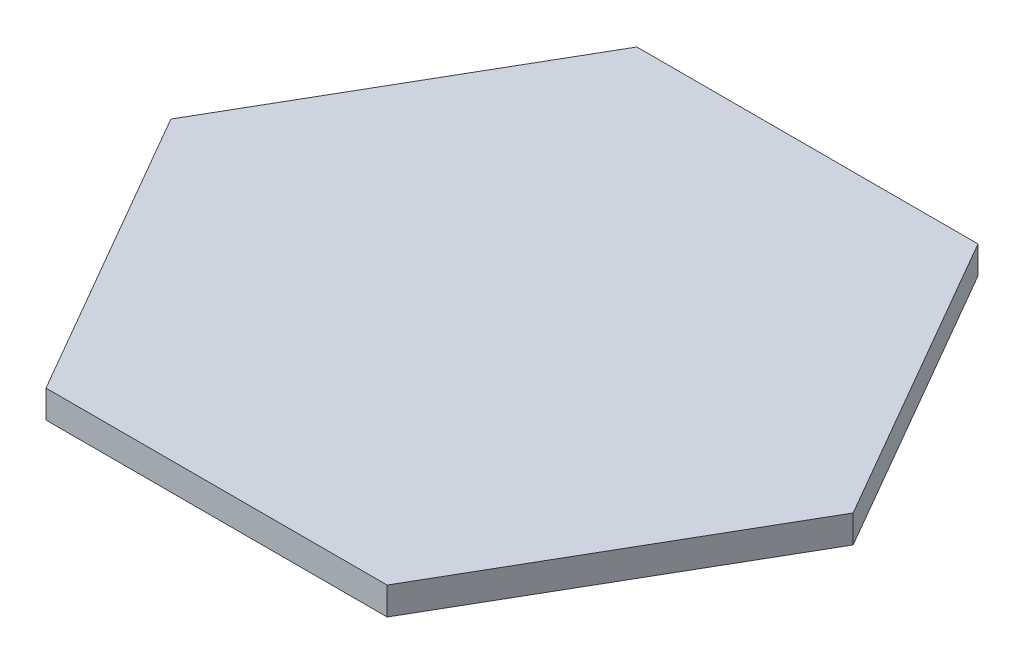
ISO-10303-21;
HEADER;
FILE_DESCRIPTION(('STEP AP214'),'2;1');
FILE_NAME('part.step','',(''),(''),'','','');
FILE_SCHEMA(('AUTOMOTIVE_DESIGN { 1 0 10303 214 1 1 1 1 }'));
ENDSEC;
DATA;
#1=APPLICATION_CONTEXT('core data for automotive mechanical design processes');
#2=APPLICATION_PROTOCOL_DEFINITION('international standard','automotive_design',2000,#1);
#3=PRODUCT_CONTEXT('',#1,'mechanical');
#4=PRODUCT('Part','Part','',(#3));
#5=PRODUCT_RELATED_PRODUCT_CATEGORY('part','',(#4));
#6=PRODUCT_DEFINITION_FORMATION('','',#4);
#7=PRODUCT_DEFINITION_CONTEXT('part definition',#1,'design');
#8=PRODUCT_DEFINITION('design','',#6,#7);
#9=PRODUCT_DEFINITION_SHAPE('','',#8);
#10=(LENGTH_UNIT() NAMED_UNIT(*) SI_UNIT(.MILLI.,.METRE.));
#11=(NAMED_UNIT(*) PLANE_ANGLE_UNIT() SI_UNIT($,.RADIAN.));
#12=(NAMED_UNIT(*) SI_UNIT($,.STERADIAN.) SOLID_ANGLE_UNIT());
#13=UNCERTAINTY_MEASURE_WITH_UNIT(LENGTH_MEASURE(1.E-05),#10,'distance_accuracy_value','');
#14=(GEOMETRIC_REPRESENTATION_CONTEXT(3) GLOBAL_UNCERTAINTY_ASSIGNED_CONTEXT((#13)) GLOBAL_UNIT_ASSIGNED_CONTEXT((#10,
#11,#12)) REPRESENTATION_CONTEXT('',''));
#15=CARTESIAN_POINT('',(0.,0.,0.));
#16=DIRECTION('',(0.,0.,1.));
#17=DIRECTION('',(1.,0.,0.));
#18=AXIS2_PLACEMENT_3D('',#15,#16,#17);
#19=CARTESIAN_POINT('',(-117.317574699332,19.05,-203.2));
#20=DIRECTION('',(0.866025403784439,0.,0.5));
#21=DIRECTION('',(0.5,0.,-0.866025403784438));
#22=AXIS2_PLACEMENT_3D('',#19,#20,#21);
#23=PLANE('',#22);
#24=DIRECTION('',(-0.5,0.,0.866025403784439));
#25=VECTOR('',#24,1.);
#26=CARTESIAN_POINT('',(-117.317574699332,0.,-203.2));
#27=LINE('',#26,#25);
#28=CARTESIAN_POINT('',(-117.317574699332,0.,-203.2));
#29=VERTEX_POINT('',#28);
#30=CARTESIAN_POINT('',(-234.635149398664,0.,0.));
#31=VERTEX_POINT('',#30);
#32=EDGE_CURVE('E117',#29,#31,#27,.T.);
#33=ORIENTED_EDGE('',*,*,#32,.T.);
#34=DIRECTION('',(0.,-1.,0.));
#35=VECTOR('',#34,1.);
#36=CARTESIAN_POINT('',(-234.635149398664,19.05,0.));
#37=LINE('',#36,#35);
#38=CARTESIAN_POINT('',(-234.635149398664,19.05,0.));
#39=VERTEX_POINT('',#38);
#40=EDGE_CURVE('E11',#39,#31,#37,.T.);
#41=ORIENTED_EDGE('',*,*,#40,.F.);
#42=DIRECTION('',(-0.5,0.,0.866025403784439));
#43=VECTOR('',#42,1.);
#44=CARTESIAN_POINT('',(-117.317574699332,19.05,-203.2));
#45=LINE('',#44,#43);
#46=CARTESIAN_POINT('',(-117.317574699332,19.05,-203.2));
#47=VERTEX_POINT('',#46);
#48=EDGE_CURVE('E127',#47,#39,#45,.T.);
#49=ORIENTED_EDGE('',*,*,#48,.F.);
#50=DIRECTION('',(0.,-1.,0.));
#51=VECTOR('',#50,1.);
#52=CARTESIAN_POINT('',(-117.317574699332,19.05,-203.2));
#53=LINE('',#52,#51);
#54=EDGE_CURVE('E113',#47,#29,#53,.T.);
#55=ORIENTED_EDGE('',*,*,#54,.T.);
#56=EDGE_LOOP('',(#33,#41,#49,#55));
#57=FACE_BOUND('',#56,.T.);
#58=ADVANCED_FACE('F33',(#57),#23,.F.);
#59=CARTESIAN_POINT('',(-234.635149398664,19.05,0.));
#60=DIRECTION('',(0.866025403784439,0.,-0.5));
#61=DIRECTION('',(-0.5,0.,-0.866025403784439));
#62=AXIS2_PLACEMENT_3D('',#59,#60,#61);
#63=PLANE('',#62);
#64=DIRECTION('',(0.5,0.,0.866025403784439));
#65=VECTOR('',#64,1.);
#66=CARTESIAN_POINT('',(-234.635149398664,0.,0.));
#67=LINE('',#66,#65);
#68=CARTESIAN_POINT('',(-117.317574699332,0.,203.2));
#69=VERTEX_POINT('',#68);
#70=EDGE_CURVE('E120',#31,#69,#67,.T.);
#71=ORIENTED_EDGE('',*,*,#70,.T.);
#72=DIRECTION('',(0.,-1.,0.));
#73=VECTOR('',#72,1.);
#74=CARTESIAN_POINT('',(-117.317574699332,19.05,203.2));
#75=LINE('',#74,#73);
#76=CARTESIAN_POINT('',(-117.317574699332,19.05,203.2));
#77=VERTEX_POINT('',#76);
#78=EDGE_CURVE('E41',#77,#69,#75,.T.);
#79=ORIENTED_EDGE('',*,*,#78,.F.);
#80=DIRECTION('',(0.5,0.,0.866025403784439));
#81=VECTOR('',#80,1.);
#82=CARTESIAN_POINT('',(-234.635149398664,19.05,0.));
#83=LINE('',#82,#81);
#84=EDGE_CURVE('E86',#39,#77,#83,.T.);
#85=ORIENTED_EDGE('',*,*,#84,.F.);
#86=ORIENTED_EDGE('',*,*,#40,.T.);
#87=EDGE_LOOP('',(#71,#79,#85,#86));
#88=FACE_BOUND('',#87,.T.);
#89=ADVANCED_FACE('F151',(#88),#63,.F.);
#90=CARTESIAN_POINT('',(-117.317574699332,19.05,203.2));
#91=DIRECTION('',(0.,0.,-1.));
#92=DIRECTION('',(-1.,0.,0.));
#93=AXIS2_PLACEMENT_3D('',#90,#91,#92);
#94=PLANE('',#93);
#95=DIRECTION('',(1.,0.,0.));
#96=VECTOR('',#95,1.);
#97=CARTESIAN_POINT('',(-117.317574699332,0.,203.2));
#98=LINE('',#97,#96);
#99=CARTESIAN_POINT('',(117.317574699332,0.,203.2));
#100=VERTEX_POINT('',#99);
#101=EDGE_CURVE('E122',#69,#100,#98,.T.);
#102=ORIENTED_EDGE('',*,*,#101,.T.);
#103=DIRECTION('',(0.,-1.,0.));
#104=VECTOR('',#103,1.);
#105=CARTESIAN_POINT('',(117.317574699332,19.05,203.2));
#106=LINE('',#105,#104);
#107=CARTESIAN_POINT('',(117.317574699332,19.05,203.2));
#108=VERTEX_POINT('',#107);
#109=EDGE_CURVE('E108',#108,#100,#106,.T.);
#110=ORIENTED_EDGE('',*,*,#109,.F.);
#111=DIRECTION('',(1.,0.,0.));
#112=VECTOR('',#111,1.);
#113=CARTESIAN_POINT('',(-117.317574699332,19.05,203.2));
#114=LINE('',#113,#112);
#115=EDGE_CURVE('E99',#77,#108,#114,.T.);
#116=ORIENTED_EDGE('',*,*,#115,.F.);
#117=ORIENTED_EDGE('',*,*,#78,.T.);
#118=EDGE_LOOP('',(#102,#110,#116,#117));
#119=FACE_BOUND('',#118,.T.);
#120=ADVANCED_FACE('F133',(#119),#94,.F.);
#121=CARTESIAN_POINT('',(117.317574699332,19.05,203.2));
#122=DIRECTION('',(-0.866025403784439,0.,-0.5));
#123=DIRECTION('',(-0.5,0.,0.866025403784439));
#124=AXIS2_PLACEMENT_3D('',#121,#122,#123);
#125=PLANE('',#124);
#126=DIRECTION('',(0.5,0.,-0.866025403784439));
#127=VECTOR('',#126,1.);
#128=CARTESIAN_POINT('',(117.317574699332,0.,203.2));
#129=LINE('',#128,#127);
#130=CARTESIAN_POINT('',(234.635149398664,0.,0.));
#131=VERTEX_POINT('',#130);
#132=EDGE_CURVE('E107',#100,#131,#129,.T.);
#133=ORIENTED_EDGE('',*,*,#132,.T.);
#134=DIRECTION('',(0.,-1.,0.));
#135=VECTOR('',#134,1.);
#136=CARTESIAN_POINT('',(234.635149398664,19.05,0.));
#137=LINE('',#136,#135);
#138=CARTESIAN_POINT('',(234.635149398664,19.05,0.));
#139=VERTEX_POINT('',#138);
#140=EDGE_CURVE('E104',#139,#131,#137,.T.);
#141=ORIENTED_EDGE('',*,*,#140,.F.);
#142=DIRECTION('',(0.5,0.,-0.866025403784439));
#143=VECTOR('',#142,1.);
#144=CARTESIAN_POINT('',(117.317574699332,19.05,203.2));
#145=LINE('',#144,#143);
#146=EDGE_CURVE('E93',#108,#139,#145,.T.);
#147=ORIENTED_EDGE('',*,*,#146,.F.);
#148=ORIENTED_EDGE('',*,*,#109,.T.);
#149=EDGE_LOOP('',(#133,#141,#147,#148));
#150=FACE_BOUND('',#149,.T.);
#151=ADVANCED_FACE('F105',(#150),#125,.F.);
#152=CARTESIAN_POINT('',(234.635149398664,19.05,0.));
#153=DIRECTION('',(-0.866025403784439,0.,0.5));
#154=DIRECTION('',(0.5,0.,0.866025403784439));
#155=AXIS2_PLACEMENT_3D('',#152,#153,#154);
#156=PLANE('',#155);
#157=DIRECTION('',(-0.5,0.,-0.866025403784439));
#158=VECTOR('',#157,1.);
#159=CARTESIAN_POINT('',(234.635149398664,0.,0.));
#160=LINE('',#159,#158);
#161=CARTESIAN_POINT('',(117.317574699332,0.,-203.2));
#162=VERTEX_POINT('',#161);
#163=EDGE_CURVE('E72',#131,#162,#160,.T.);
#164=ORIENTED_EDGE('',*,*,#163,.T.);
#165=DIRECTION('',(0.,-1.,0.));
#166=VECTOR('',#165,1.);
#167=CARTESIAN_POINT('',(117.317574699332,19.05,-203.2));
#168=LINE('',#167,#166);
#169=CARTESIAN_POINT('',(117.317574699332,19.05,-203.2));
#170=VERTEX_POINT('',#169);
#171=EDGE_CURVE('E109',#170,#162,#168,.T.);
#172=ORIENTED_EDGE('',*,*,#171,.F.);
#173=DIRECTION('',(-0.5,0.,-0.866025403784439));
#174=VECTOR('',#173,1.);
#175=CARTESIAN_POINT('',(234.635149398664,19.05,0.));
#176=LINE('',#175,#174);
#177=EDGE_CURVE('E97',#139,#170,#176,.T.);
#178=ORIENTED_EDGE('',*,*,#177,.F.);
#179=ORIENTED_EDGE('',*,*,#140,.T.);
#180=EDGE_LOOP('',(#164,#172,#178,#179));
#181=FACE_BOUND('',#180,.T.);
#182=ADVANCED_FACE('F111',(#181),#156,.F.);
#183=CARTESIAN_POINT('',(117.317574699332,19.05,-203.2));
#184=DIRECTION('',(0.,0.,1.));
#185=DIRECTION('',(1.,0.,0.));
#186=AXIS2_PLACEMENT_3D('',#183,#184,#185);
#187=PLANE('',#186);
#188=DIRECTION('',(-1.,0.,0.));
#189=VECTOR('',#188,1.);
#190=CARTESIAN_POINT('',(117.317574699332,0.,-203.2));
#191=LINE('',#190,#189);
#192=EDGE_CURVE('E78',#162,#29,#191,.T.);
#193=ORIENTED_EDGE('',*,*,#192,.T.);
#194=ORIENTED_EDGE('',*,*,#54,.F.);
#195=DIRECTION('',(-1.,0.,0.));
#196=VECTOR('',#195,1.);
#197=CARTESIAN_POINT('',(117.317574699332,19.05,-203.2));
#198=LINE('',#197,#196);
#199=EDGE_CURVE('E49',#170,#47,#198,.T.);
#200=ORIENTED_EDGE('',*,*,#199,.F.);
#201=ORIENTED_EDGE('',*,*,#171,.T.);
#202=EDGE_LOOP('',(#193,#194,#200,#201));
#203=FACE_BOUND('',#202,.T.);
#204=ADVANCED_FACE('F140',(#203),#187,.F.);
#205=CARTESIAN_POINT('',(0.,19.05,0.));
#206=DIRECTION('',(0.,1.,0.));
#207=DIRECTION('',(0.,0.,1.));
#208=AXIS2_PLACEMENT_3D('',#205,#206,#207);
#209=PLANE('',#208);
#210=ORIENTED_EDGE('',*,*,#48,.T.);
#211=ORIENTED_EDGE('',*,*,#84,.T.);
#212=ORIENTED_EDGE('',*,*,#115,.T.);
#213=ORIENTED_EDGE('',*,*,#146,.T.);
#214=ORIENTED_EDGE('',*,*,#177,.T.);
#215=ORIENTED_EDGE('',*,*,#199,.T.);
#216=EDGE_LOOP('',(#210,#211,#212,#213,#214,#215));
#217=FACE_BOUND('',#216,.T.);
#218=ADVANCED_FACE('F95',(#217),#209,.T.);
#219=CARTESIAN_POINT('',(0.,0.,0.));
#220=DIRECTION('',(0.,1.,0.));
#221=DIRECTION('',(0.,0.,1.));
#222=AXIS2_PLACEMENT_3D('',#219,#220,#221);
#223=PLANE('',#222);
#224=ORIENTED_EDGE('',*,*,#32,.F.);
#225=ORIENTED_EDGE('',*,*,#192,.F.);
#226=ORIENTED_EDGE('',*,*,#163,.F.);
#227=ORIENTED_EDGE('',*,*,#132,.F.);
#228=ORIENTED_EDGE('',*,*,#101,.F.);
#229=ORIENTED_EDGE('',*,*,#70,.F.);
#230=EDGE_LOOP('',(#224,#225,#226,#227,#228,#229));
#231=FACE_BOUND('',#230,.T.);
#232=ADVANCED_FACE('F136',(#231),#223,.F.);
#233=CLOSED_SHELL('',(#58,#89,#120,#151,#182,#204,#218,#232));
#234=MANIFOLD_SOLID_BREP('B2',#233);
#235=ADVANCED_BREP_SHAPE_REPRESENTATION('',(#18,#234),#14);
#236=SHAPE_DEFINITION_REPRESENTATION(#9,#235);
ENDSEC;
END-ISO-10303-21;
